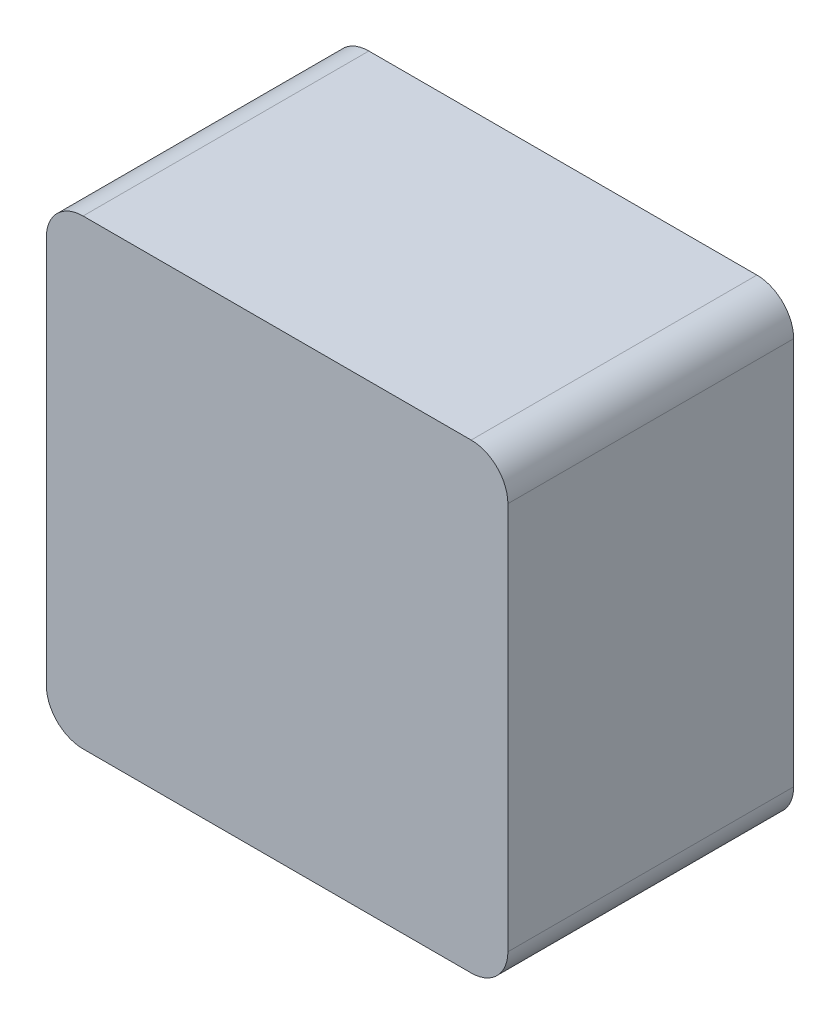
ISO-10303-21;
HEADER;
FILE_DESCRIPTION(('STEP AP214'),'2;1');
FILE_NAME('part.step','',(''),(''),'','','');
FILE_SCHEMA(('AUTOMOTIVE_DESIGN { 1 0 10303 214 1 1 1 1 }'));
ENDSEC;
DATA;
#1=APPLICATION_CONTEXT('core data for automotive mechanical design processes');
#2=APPLICATION_PROTOCOL_DEFINITION('international standard','automotive_design',2000,#1);
#3=PRODUCT_CONTEXT('',#1,'mechanical');
#4=PRODUCT('Part','Part','',(#3));
#5=PRODUCT_RELATED_PRODUCT_CATEGORY('part','',(#4));
#6=PRODUCT_DEFINITION_FORMATION('','',#4);
#7=PRODUCT_DEFINITION_CONTEXT('part definition',#1,'design');
#8=PRODUCT_DEFINITION('design','',#6,#7);
#9=PRODUCT_DEFINITION_SHAPE('','',#8);
#10=(LENGTH_UNIT() NAMED_UNIT(*) SI_UNIT(.MILLI.,.METRE.));
#11=(NAMED_UNIT(*) PLANE_ANGLE_UNIT() SI_UNIT($,.RADIAN.));
#12=(NAMED_UNIT(*) SI_UNIT($,.STERADIAN.) SOLID_ANGLE_UNIT());
#13=UNCERTAINTY_MEASURE_WITH_UNIT(LENGTH_MEASURE(1.E-05),#10,'distance_accuracy_value','');
#14=(GEOMETRIC_REPRESENTATION_CONTEXT(3) GLOBAL_UNCERTAINTY_ASSIGNED_CONTEXT((#13)) GLOBAL_UNIT_ASSIGNED_CONTEXT((#10,
#11,#12)) REPRESENTATION_CONTEXT('',''));
#15=CARTESIAN_POINT('',(0.,0.,0.));
#16=DIRECTION('',(0.,0.,1.));
#17=DIRECTION('',(1.,0.,0.));
#18=AXIS2_PLACEMENT_3D('',#15,#16,#17);
#19=CARTESIAN_POINT('',(-47.53,47.53,0.));
#20=DIRECTION('',(0.,0.,1.));
#21=DIRECTION('',(1.,0.,0.));
#22=AXIS2_PLACEMENT_3D('',#19,#20,#21);
#23=PLANE('',#22);
#24=CARTESIAN_POINT('',(-47.53,47.53,0.));
#25=DIRECTION('',(0.,0.,1.));
#26=DIRECTION('',(1.,0.,0.));
#27=AXIS2_PLACEMENT_3D('',#24,#25,#26);
#28=CIRCLE('',#27,9.);
#29=CARTESIAN_POINT('',(-47.53,56.53,0.));
#30=VERTEX_POINT('',#29);
#31=CARTESIAN_POINT('',(-56.53,47.53,0.));
#32=VERTEX_POINT('',#31);
#33=EDGE_CURVE('E303',#30,#32,#28,.T.);
#34=ORIENTED_EDGE('',*,*,#33,.F.);
#35=DIRECTION('',(-1.,0.,0.));
#36=VECTOR('',#35,1.);
#37=CARTESIAN_POINT('',(-47.53,56.53,0.));
#38=LINE('',#37,#36);
#39=CARTESIAN_POINT('',(47.5299999999999,56.53,0.));
#40=VERTEX_POINT('',#39);
#41=EDGE_CURVE('E318',#40,#30,#38,.T.);
#42=ORIENTED_EDGE('',*,*,#41,.F.);
#43=CARTESIAN_POINT('',(47.53,47.53,0.));
#44=DIRECTION('',(0.,0.,1.));
#45=DIRECTION('',(-1.,0.,0.));
#46=AXIS2_PLACEMENT_3D('',#43,#44,#45);
#47=CIRCLE('',#46,9.);
#48=CARTESIAN_POINT('',(56.53,47.5299999999999,0.));
#49=VERTEX_POINT('',#48);
#50=EDGE_CURVE('E316',#49,#40,#47,.T.);
#51=ORIENTED_EDGE('',*,*,#50,.F.);
#52=DIRECTION('',(0.,1.,0.));
#53=VECTOR('',#52,1.);
#54=CARTESIAN_POINT('',(56.53,47.5299999999999,0.));
#55=LINE('',#54,#53);
#56=CARTESIAN_POINT('',(56.53,-47.53,0.));
#57=VERTEX_POINT('',#56);
#58=EDGE_CURVE('E314',#57,#49,#55,.T.);
#59=ORIENTED_EDGE('',*,*,#58,.F.);
#60=CARTESIAN_POINT('',(47.53,-47.53,0.));
#61=DIRECTION('',(0.,0.,1.));
#62=DIRECTION('',(1.,0.,0.));
#63=AXIS2_PLACEMENT_3D('',#60,#61,#62);
#64=CIRCLE('',#63,9.);
#65=CARTESIAN_POINT('',(47.5299999999999,-56.53,0.));
#66=VERTEX_POINT('',#65);
#67=EDGE_CURVE('E312',#66,#57,#64,.T.);
#68=ORIENTED_EDGE('',*,*,#67,.F.);
#69=DIRECTION('',(1.,0.,0.));
#70=VECTOR('',#69,1.);
#71=CARTESIAN_POINT('',(-47.53,-56.53,0.));
#72=LINE('',#71,#70);
#73=CARTESIAN_POINT('',(-47.53,-56.53,0.));
#74=VERTEX_POINT('',#73);
#75=EDGE_CURVE('E310',#74,#66,#72,.T.);
#76=ORIENTED_EDGE('',*,*,#75,.F.);
#77=CARTESIAN_POINT('',(-47.53,-47.53,0.));
#78=DIRECTION('',(0.,0.,1.));
#79=DIRECTION('',(1.,0.,0.));
#80=AXIS2_PLACEMENT_3D('',#77,#78,#79);
#81=CIRCLE('',#80,9.);
#82=CARTESIAN_POINT('',(-56.53,-47.5299999999999,0.));
#83=VERTEX_POINT('',#82);
#84=EDGE_CURVE('E308',#83,#74,#81,.T.);
#85=ORIENTED_EDGE('',*,*,#84,.F.);
#86=DIRECTION('',(0.,-1.,0.));
#87=VECTOR('',#86,1.);
#88=CARTESIAN_POINT('',(-56.53,47.53,0.));
#89=LINE('',#88,#87);
#90=EDGE_CURVE('E306',#32,#83,#89,.T.);
#91=ORIENTED_EDGE('',*,*,#90,.F.);
#92=EDGE_LOOP('',(#34,#42,#51,#59,#68,#76,#85,#91));
#93=FACE_BOUND('',#92,.T.);
#94=CARTESIAN_POINT('',(47.53,47.53,0.));
#95=DIRECTION('',(0.,0.,1.));
#96=DIRECTION('',(-1.,0.,0.));
#97=AXIS2_PLACEMENT_3D('',#94,#95,#96);
#98=CIRCLE('',#97,5.);
#99=CARTESIAN_POINT('',(52.53,47.53,0.));
#100=VERTEX_POINT('',#99);
#101=CARTESIAN_POINT('',(47.5299999999999,52.53,0.));
#102=VERTEX_POINT('',#101);
#103=EDGE_CURVE('E237',#100,#102,#98,.T.);
#104=ORIENTED_EDGE('',*,*,#103,.T.);
#105=DIRECTION('',(-1.,0.,0.));
#106=VECTOR('',#105,1.);
#107=CARTESIAN_POINT('',(-47.53,52.53,0.));
#108=LINE('',#107,#106);
#109=CARTESIAN_POINT('',(-47.53,52.53,0.));
#110=VERTEX_POINT('',#109);
#111=EDGE_CURVE('E266',#102,#110,#108,.T.);
#112=ORIENTED_EDGE('',*,*,#111,.T.);
#113=CARTESIAN_POINT('',(-47.53,47.53,0.));
#114=DIRECTION('',(0.,0.,1.));
#115=DIRECTION('',(1.,0.,0.));
#116=AXIS2_PLACEMENT_3D('',#113,#114,#115);
#117=CIRCLE('',#116,5.);
#118=CARTESIAN_POINT('',(-52.53,47.53,0.));
#119=VERTEX_POINT('',#118);
#120=EDGE_CURVE('E269',#110,#119,#117,.T.);
#121=ORIENTED_EDGE('',*,*,#120,.T.);
#122=DIRECTION('',(0.,-1.,0.));
#123=VECTOR('',#122,1.);
#124=CARTESIAN_POINT('',(-52.53,47.53,0.));
#125=LINE('',#124,#123);
#126=CARTESIAN_POINT('',(-52.53,-47.53,0.));
#127=VERTEX_POINT('',#126);
#128=EDGE_CURVE('E272',#119,#127,#125,.T.);
#129=ORIENTED_EDGE('',*,*,#128,.T.);
#130=CARTESIAN_POINT('',(-47.53,-47.53,0.));
#131=DIRECTION('',(0.,0.,1.));
#132=DIRECTION('',(1.,0.,0.));
#133=AXIS2_PLACEMENT_3D('',#130,#131,#132);
#134=CIRCLE('',#133,5.);
#135=CARTESIAN_POINT('',(-47.53,-52.53,0.));
#136=VERTEX_POINT('',#135);
#137=EDGE_CURVE('E275',#127,#136,#134,.T.);
#138=ORIENTED_EDGE('',*,*,#137,.T.);
#139=DIRECTION('',(1.,0.,0.));
#140=VECTOR('',#139,1.);
#141=CARTESIAN_POINT('',(-47.53,-52.53,0.));
#142=LINE('',#141,#140);
#143=CARTESIAN_POINT('',(47.5299999999999,-52.53,0.));
#144=VERTEX_POINT('',#143);
#145=EDGE_CURVE('E278',#136,#144,#142,.T.);
#146=ORIENTED_EDGE('',*,*,#145,.T.);
#147=CARTESIAN_POINT('',(47.53,-47.53,0.));
#148=DIRECTION('',(0.,0.,1.));
#149=DIRECTION('',(1.,0.,0.));
#150=AXIS2_PLACEMENT_3D('',#147,#148,#149);
#151=CIRCLE('',#150,5.);
#152=CARTESIAN_POINT('',(52.53,-47.53,0.));
#153=VERTEX_POINT('',#152);
#154=EDGE_CURVE('E281',#144,#153,#151,.T.);
#155=ORIENTED_EDGE('',*,*,#154,.T.);
#156=DIRECTION('',(0.,1.,0.));
#157=VECTOR('',#156,1.);
#158=CARTESIAN_POINT('',(52.53,47.53,0.));
#159=LINE('',#158,#157);
#160=EDGE_CURVE('E242',#153,#100,#159,.T.);
#161=ORIENTED_EDGE('',*,*,#160,.T.);
#162=EDGE_LOOP('',(#104,#112,#121,#129,#138,#146,#155,#161));
#163=FACE_BOUND('',#162,.T.);
#164=ADVANCED_FACE('F40',(#93,#163),#23,.F.);
#165=CARTESIAN_POINT('',(-47.53,47.53,68.58));
#166=DIRECTION('',(0.,0.,-1.));
#167=DIRECTION('',(-1.,0.,0.));
#168=AXIS2_PLACEMENT_3D('',#165,#166,#167);
#169=CYLINDRICAL_SURFACE('',#168,9.);
#170=ORIENTED_EDGE('',*,*,#33,.T.);
#171=DIRECTION('',(0.,0.,-1.));
#172=VECTOR('',#171,1.);
#173=CARTESIAN_POINT('',(-56.53,47.53,68.58));
#174=LINE('',#173,#172);
#175=CARTESIAN_POINT('',(-56.53,47.53,70.));
#176=VERTEX_POINT('',#175);
#177=EDGE_CURVE('E11',#176,#32,#174,.T.);
#178=ORIENTED_EDGE('',*,*,#177,.F.);
#179=CARTESIAN_POINT('',(-47.53,47.53,70.));
#180=DIRECTION('',(0.,0.,1.));
#181=DIRECTION('',(1.,0.,0.));
#182=AXIS2_PLACEMENT_3D('',#179,#180,#181);
#183=CIRCLE('',#182,9.);
#184=CARTESIAN_POINT('',(-47.53,56.53,70.));
#185=VERTEX_POINT('',#184);
#186=EDGE_CURVE('E194',#185,#176,#183,.T.);
#187=ORIENTED_EDGE('',*,*,#186,.F.);
#188=DIRECTION('',(0.,0.,-1.));
#189=VECTOR('',#188,1.);
#190=CARTESIAN_POINT('',(-47.53,56.53,68.58));
#191=LINE('',#190,#189);
#192=EDGE_CURVE('E320',#185,#30,#191,.T.);
#193=ORIENTED_EDGE('',*,*,#192,.T.);
#194=EDGE_LOOP('',(#170,#178,#187,#193));
#195=FACE_BOUND('',#194,.T.);
#196=ADVANCED_FACE('F42',(#195),#169,.T.);
#197=CARTESIAN_POINT('',(-56.53,47.53,68.58));
#198=DIRECTION('',(1.,0.,0.));
#199=DIRECTION('',(0.,0.,-1.));
#200=AXIS2_PLACEMENT_3D('',#197,#198,#199);
#201=PLANE('',#200);
#202=DIRECTION('',(0.,0.,-1.));
#203=VECTOR('',#202,1.);
#204=CARTESIAN_POINT('',(-56.53,46.03,63.));
#205=LINE('',#204,#203);
#206=CARTESIAN_POINT('',(-56.53,46.03,68.));
#207=VERTEX_POINT('',#206);
#208=CARTESIAN_POINT('',(-56.53,46.03,63.));
#209=VERTEX_POINT('',#208);
#210=EDGE_CURVE('E200',#207,#209,#205,.T.);
#211=ORIENTED_EDGE('',*,*,#210,.F.);
#212=DIRECTION('',(0.,1.,0.));
#213=VECTOR('',#212,1.);
#214=CARTESIAN_POINT('',(-56.53,46.03,68.));
#215=LINE('',#214,#213);
#216=CARTESIAN_POINT('',(-56.53,-46.03,68.));
#217=VERTEX_POINT('',#216);
#218=EDGE_CURVE('E55',#217,#207,#215,.T.);
#219=ORIENTED_EDGE('',*,*,#218,.F.);
#220=DIRECTION('',(0.,0.,1.));
#221=VECTOR('',#220,1.);
#222=CARTESIAN_POINT('',(-56.53,-46.03,63.));
#223=LINE('',#222,#221);
#224=CARTESIAN_POINT('',(-56.53,-46.03,63.));
#225=VERTEX_POINT('',#224);
#226=EDGE_CURVE('E187',#225,#217,#223,.T.);
#227=ORIENTED_EDGE('',*,*,#226,.F.);
#228=DIRECTION('',(0.,-1.,0.));
#229=VECTOR('',#228,1.);
#230=CARTESIAN_POINT('',(-56.53,46.03,63.));
#231=LINE('',#230,#229);
#232=EDGE_CURVE('E195',#209,#225,#231,.T.);
#233=ORIENTED_EDGE('',*,*,#232,.F.);
#234=EDGE_LOOP('',(#211,#219,#227,#233));
#235=FACE_BOUND('',#234,.T.);
#236=ORIENTED_EDGE('',*,*,#90,.T.);
#237=DIRECTION('',(0.,0.,-1.));
#238=VECTOR('',#237,1.);
#239=CARTESIAN_POINT('',(-56.53,-47.5299999999999,68.58));
#240=LINE('',#239,#238);
#241=CARTESIAN_POINT('',(-56.53,-47.5299999999999,70.));
#242=VERTEX_POINT('',#241);
#243=EDGE_CURVE('E48',#242,#83,#240,.T.);
#244=ORIENTED_EDGE('',*,*,#243,.F.);
#245=DIRECTION('',(0.,-1.,0.));
#246=VECTOR('',#245,1.);
#247=CARTESIAN_POINT('',(-56.53,47.53,70.));
#248=LINE('',#247,#246);
#249=EDGE_CURVE('E216',#176,#242,#248,.T.);
#250=ORIENTED_EDGE('',*,*,#249,.F.);
#251=ORIENTED_EDGE('',*,*,#177,.T.);
#252=EDGE_LOOP('',(#236,#244,#250,#251));
#253=FACE_BOUND('',#252,.T.);
#254=ADVANCED_FACE('F198',(#235,#253),#201,.F.);
#255=CARTESIAN_POINT('',(-47.53,-47.53,68.58));
#256=DIRECTION('',(0.,0.,-1.));
#257=DIRECTION('',(-1.,0.,0.));
#258=AXIS2_PLACEMENT_3D('',#255,#256,#257);
#259=CYLINDRICAL_SURFACE('',#258,9.);
#260=ORIENTED_EDGE('',*,*,#84,.T.);
#261=DIRECTION('',(0.,0.,-1.));
#262=VECTOR('',#261,1.);
#263=CARTESIAN_POINT('',(-47.53,-56.53,68.58));
#264=LINE('',#263,#262);
#265=CARTESIAN_POINT('',(-47.53,-56.53,70.));
#266=VERTEX_POINT('',#265);
#267=EDGE_CURVE('E335',#266,#74,#264,.T.);
#268=ORIENTED_EDGE('',*,*,#267,.F.);
#269=CARTESIAN_POINT('',(-47.53,-47.53,70.));
#270=DIRECTION('',(0.,0.,1.));
#271=DIRECTION('',(1.,0.,0.));
#272=AXIS2_PLACEMENT_3D('',#269,#270,#271);
#273=CIRCLE('',#272,9.);
#274=EDGE_CURVE('E219',#242,#266,#273,.T.);
#275=ORIENTED_EDGE('',*,*,#274,.F.);
#276=ORIENTED_EDGE('',*,*,#243,.T.);
#277=EDGE_LOOP('',(#260,#268,#275,#276));
#278=FACE_BOUND('',#277,.T.);
#279=ADVANCED_FACE('F341',(#278),#259,.T.);
#280=CARTESIAN_POINT('',(-47.53,-56.53,68.58));
#281=DIRECTION('',(0.,1.,0.));
#282=DIRECTION('',(0.,0.,1.));
#283=AXIS2_PLACEMENT_3D('',#280,#281,#282);
#284=PLANE('',#283);
#285=ORIENTED_EDGE('',*,*,#75,.T.);
#286=DIRECTION('',(0.,0.,-1.));
#287=VECTOR('',#286,1.);
#288=CARTESIAN_POINT('',(47.5299999999999,-56.53,68.58));
#289=LINE('',#288,#287);
#290=CARTESIAN_POINT('',(47.5299999999999,-56.53,70.));
#291=VERTEX_POINT('',#290);
#292=EDGE_CURVE('E332',#291,#66,#289,.T.);
#293=ORIENTED_EDGE('',*,*,#292,.F.);
#294=DIRECTION('',(1.,0.,0.));
#295=VECTOR('',#294,1.);
#296=CARTESIAN_POINT('',(-47.53,-56.53,70.));
#297=LINE('',#296,#295);
#298=EDGE_CURVE('E222',#266,#291,#297,.T.);
#299=ORIENTED_EDGE('',*,*,#298,.F.);
#300=ORIENTED_EDGE('',*,*,#267,.T.);
#301=EDGE_LOOP('',(#285,#293,#299,#300));
#302=FACE_BOUND('',#301,.T.);
#303=ADVANCED_FACE('F350',(#302),#284,.F.);
#304=CARTESIAN_POINT('',(47.53,-47.53,68.58));
#305=DIRECTION('',(0.,0.,-1.));
#306=DIRECTION('',(-1.,0.,0.));
#307=AXIS2_PLACEMENT_3D('',#304,#305,#306);
#308=CYLINDRICAL_SURFACE('',#307,9.);
#309=ORIENTED_EDGE('',*,*,#67,.T.);
#310=DIRECTION('',(0.,0.,-1.));
#311=VECTOR('',#310,1.);
#312=CARTESIAN_POINT('',(56.53,-47.53,68.58));
#313=LINE('',#312,#311);
#314=CARTESIAN_POINT('',(56.53,-47.53,70.));
#315=VERTEX_POINT('',#314);
#316=EDGE_CURVE('E329',#315,#57,#313,.T.);
#317=ORIENTED_EDGE('',*,*,#316,.F.);
#318=CARTESIAN_POINT('',(47.53,-47.53,70.));
#319=DIRECTION('',(0.,0.,1.));
#320=DIRECTION('',(1.,0.,0.));
#321=AXIS2_PLACEMENT_3D('',#318,#319,#320);
#322=CIRCLE('',#321,9.);
#323=EDGE_CURVE('E225',#291,#315,#322,.T.);
#324=ORIENTED_EDGE('',*,*,#323,.F.);
#325=ORIENTED_EDGE('',*,*,#292,.T.);
#326=EDGE_LOOP('',(#309,#317,#324,#325));
#327=FACE_BOUND('',#326,.T.);
#328=ADVANCED_FACE('F354',(#327),#308,.T.);
#329=CARTESIAN_POINT('',(56.53,47.5299999999999,68.58));
#330=DIRECTION('',(-1.,0.,0.));
#331=DIRECTION('',(0.,0.,1.));
#332=AXIS2_PLACEMENT_3D('',#329,#330,#331);
#333=PLANE('',#332);
#334=ORIENTED_EDGE('',*,*,#58,.T.);
#335=DIRECTION('',(0.,0.,-1.));
#336=VECTOR('',#335,1.);
#337=CARTESIAN_POINT('',(56.53,47.5299999999999,68.58));
#338=LINE('',#337,#336);
#339=CARTESIAN_POINT('',(56.53,47.5299999999999,70.));
#340=VERTEX_POINT('',#339);
#341=EDGE_CURVE('E326',#340,#49,#338,.T.);
#342=ORIENTED_EDGE('',*,*,#341,.F.);
#343=DIRECTION('',(0.,1.,0.));
#344=VECTOR('',#343,1.);
#345=CARTESIAN_POINT('',(56.53,-47.53,70.));
#346=LINE('',#345,#344);
#347=EDGE_CURVE('E228',#315,#340,#346,.T.);
#348=ORIENTED_EDGE('',*,*,#347,.F.);
#349=ORIENTED_EDGE('',*,*,#316,.T.);
#350=EDGE_LOOP('',(#334,#342,#348,#349));
#351=FACE_BOUND('',#350,.T.);
#352=ADVANCED_FACE('F360',(#351),#333,.F.);
#353=CARTESIAN_POINT('',(47.53,47.53,68.58));
#354=DIRECTION('',(0.,0.,-1.));
#355=DIRECTION('',(-1.,0.,0.));
#356=AXIS2_PLACEMENT_3D('',#353,#354,#355);
#357=CYLINDRICAL_SURFACE('',#356,9.);
#358=ORIENTED_EDGE('',*,*,#50,.T.);
#359=DIRECTION('',(0.,0.,-1.));
#360=VECTOR('',#359,1.);
#361=CARTESIAN_POINT('',(47.5299999999999,56.53,68.58));
#362=LINE('',#361,#360);
#363=CARTESIAN_POINT('',(47.5299999999999,56.53,70.));
#364=VERTEX_POINT('',#363);
#365=EDGE_CURVE('E323',#364,#40,#362,.T.);
#366=ORIENTED_EDGE('',*,*,#365,.F.);
#367=CARTESIAN_POINT('',(47.53,47.53,70.));
#368=DIRECTION('',(0.,0.,1.));
#369=DIRECTION('',(1.,0.,0.));
#370=AXIS2_PLACEMENT_3D('',#367,#368,#369);
#371=CIRCLE('',#370,9.);
#372=EDGE_CURVE('E231',#340,#364,#371,.T.);
#373=ORIENTED_EDGE('',*,*,#372,.F.);
#374=ORIENTED_EDGE('',*,*,#341,.T.);
#375=EDGE_LOOP('',(#358,#366,#373,#374));
#376=FACE_BOUND('',#375,.T.);
#377=ADVANCED_FACE('F363',(#376),#357,.T.);
#378=CARTESIAN_POINT('',(-47.53,56.53,68.58));
#379=DIRECTION('',(0.,-1.,0.));
#380=DIRECTION('',(0.,0.,-1.));
#381=AXIS2_PLACEMENT_3D('',#378,#379,#380);
#382=PLANE('',#381);
#383=ORIENTED_EDGE('',*,*,#41,.T.);
#384=ORIENTED_EDGE('',*,*,#192,.F.);
#385=DIRECTION('',(-1.,0.,0.));
#386=VECTOR('',#385,1.);
#387=CARTESIAN_POINT('',(47.5299999999999,56.53,70.));
#388=LINE('',#387,#386);
#389=EDGE_CURVE('E234',#364,#185,#388,.T.);
#390=ORIENTED_EDGE('',*,*,#389,.F.);
#391=ORIENTED_EDGE('',*,*,#365,.T.);
#392=EDGE_LOOP('',(#383,#384,#390,#391));
#393=FACE_BOUND('',#392,.T.);
#394=ADVANCED_FACE('F366',(#393),#382,.F.);
#395=CARTESIAN_POINT('',(47.53,47.53,68.58));
#396=DIRECTION('',(0.,0.,-1.));
#397=DIRECTION('',(-1.,0.,0.));
#398=AXIS2_PLACEMENT_3D('',#395,#396,#397);
#399=CYLINDRICAL_SURFACE('',#398,5.);
#400=ORIENTED_EDGE('',*,*,#103,.F.);
#401=DIRECTION('',(0.,0.,-1.));
#402=VECTOR('',#401,1.);
#403=CARTESIAN_POINT('',(52.53,47.53,68.58));
#404=LINE('',#403,#402);
#405=CARTESIAN_POINT('',(52.53,47.53,68.58));
#406=VERTEX_POINT('',#405);
#407=EDGE_CURVE('E263',#406,#100,#404,.T.);
#408=ORIENTED_EDGE('',*,*,#407,.F.);
#409=CARTESIAN_POINT('',(47.53,47.53,68.58));
#410=DIRECTION('',(0.,0.,1.));
#411=DIRECTION('',(-1.,0.,0.));
#412=AXIS2_PLACEMENT_3D('',#409,#410,#411);
#413=CIRCLE('',#412,5.);
#414=CARTESIAN_POINT('',(47.5299999999999,52.53,68.58));
#415=VERTEX_POINT('',#414);
#416=EDGE_CURVE('E238',#406,#415,#413,.T.);
#417=ORIENTED_EDGE('',*,*,#416,.T.);
#418=DIRECTION('',(0.,0.,-1.));
#419=VECTOR('',#418,1.);
#420=CARTESIAN_POINT('',(47.5299999999999,52.53,68.58));
#421=LINE('',#420,#419);
#422=EDGE_CURVE('E300',#415,#102,#421,.T.);
#423=ORIENTED_EDGE('',*,*,#422,.T.);
#424=EDGE_LOOP('',(#400,#408,#417,#423));
#425=FACE_BOUND('',#424,.T.);
#426=ADVANCED_FACE('F384',(#425),#399,.F.);
#427=CARTESIAN_POINT('',(-47.53,52.53,68.58));
#428=DIRECTION('',(0.,-1.,0.));
#429=DIRECTION('',(0.,0.,-1.));
#430=AXIS2_PLACEMENT_3D('',#427,#428,#429);
#431=PLANE('',#430);
#432=ORIENTED_EDGE('',*,*,#111,.F.);
#433=ORIENTED_EDGE('',*,*,#422,.F.);
#434=DIRECTION('',(-1.,0.,0.));
#435=VECTOR('',#434,1.);
#436=CARTESIAN_POINT('',(-47.53,52.53,68.58));
#437=LINE('',#436,#435);
#438=CARTESIAN_POINT('',(-47.53,52.53,68.58));
#439=VERTEX_POINT('',#438);
#440=EDGE_CURVE('E241',#415,#439,#437,.T.);
#441=ORIENTED_EDGE('',*,*,#440,.T.);
#442=DIRECTION('',(0.,0.,-1.));
#443=VECTOR('',#442,1.);
#444=CARTESIAN_POINT('',(-47.53,52.53,68.58));
#445=LINE('',#444,#443);
#446=EDGE_CURVE('E298',#439,#110,#445,.T.);
#447=ORIENTED_EDGE('',*,*,#446,.T.);
#448=EDGE_LOOP('',(#432,#433,#441,#447));
#449=FACE_BOUND('',#448,.T.);
#450=ADVANCED_FACE('F421',(#449),#431,.T.);
#451=CARTESIAN_POINT('',(-47.53,47.53,68.58));
#452=DIRECTION('',(0.,0.,-1.));
#453=DIRECTION('',(-1.,0.,0.));
#454=AXIS2_PLACEMENT_3D('',#451,#452,#453);
#455=CYLINDRICAL_SURFACE('',#454,5.);
#456=ORIENTED_EDGE('',*,*,#120,.F.);
#457=ORIENTED_EDGE('',*,*,#446,.F.);
#458=CARTESIAN_POINT('',(-47.53,47.53,68.58));
#459=DIRECTION('',(0.,0.,1.));
#460=DIRECTION('',(1.,0.,0.));
#461=AXIS2_PLACEMENT_3D('',#458,#459,#460);
#462=CIRCLE('',#461,5.);
#463=CARTESIAN_POINT('',(-52.53,47.53,68.58));
#464=VERTEX_POINT('',#463);
#465=EDGE_CURVE('E245',#439,#464,#462,.T.);
#466=ORIENTED_EDGE('',*,*,#465,.T.);
#467=DIRECTION('',(0.,0.,-1.));
#468=VECTOR('',#467,1.);
#469=CARTESIAN_POINT('',(-52.53,47.53,68.58));
#470=LINE('',#469,#468);
#471=EDGE_CURVE('E296',#464,#119,#470,.T.);
#472=ORIENTED_EDGE('',*,*,#471,.T.);
#473=EDGE_LOOP('',(#456,#457,#466,#472));
#474=FACE_BOUND('',#473,.T.);
#475=ADVANCED_FACE('F428',(#474),#455,.F.);
#476=CARTESIAN_POINT('',(-52.53,47.53,68.58));
#477=DIRECTION('',(1.,0.,0.));
#478=DIRECTION('',(0.,0.,-1.));
#479=AXIS2_PLACEMENT_3D('',#476,#477,#478);
#480=PLANE('',#479);
#481=DIRECTION('',(0.,1.,0.));
#482=VECTOR('',#481,1.);
#483=CARTESIAN_POINT('',(-52.53,46.03,68.));
#484=LINE('',#483,#482);
#485=CARTESIAN_POINT('',(-52.53,-46.03,68.));
#486=VERTEX_POINT('',#485);
#487=CARTESIAN_POINT('',(-52.53,46.03,68.));
#488=VERTEX_POINT('',#487);
#489=EDGE_CURVE('E180',#486,#488,#484,.T.);
#490=ORIENTED_EDGE('',*,*,#489,.T.);
#491=DIRECTION('',(0.,0.,-1.));
#492=VECTOR('',#491,1.);
#493=CARTESIAN_POINT('',(-52.53,46.03,63.));
#494=LINE('',#493,#492);
#495=CARTESIAN_POINT('',(-52.53,46.03,63.));
#496=VERTEX_POINT('',#495);
#497=EDGE_CURVE('E203',#488,#496,#494,.T.);
#498=ORIENTED_EDGE('',*,*,#497,.T.);
#499=DIRECTION('',(0.,-1.,0.));
#500=VECTOR('',#499,1.);
#501=CARTESIAN_POINT('',(-52.53,46.03,63.));
#502=LINE('',#501,#500);
#503=CARTESIAN_POINT('',(-52.53,-46.03,63.));
#504=VERTEX_POINT('',#503);
#505=EDGE_CURVE('E183',#496,#504,#502,.T.);
#506=ORIENTED_EDGE('',*,*,#505,.T.);
#507=DIRECTION('',(0.,0.,1.));
#508=VECTOR('',#507,1.);
#509=CARTESIAN_POINT('',(-52.53,-46.03,63.));
#510=LINE('',#509,#508);
#511=EDGE_CURVE('E184',#504,#486,#510,.T.);
#512=ORIENTED_EDGE('',*,*,#511,.T.);
#513=EDGE_LOOP('',(#490,#498,#506,#512));
#514=FACE_BOUND('',#513,.T.);
#515=ORIENTED_EDGE('',*,*,#128,.F.);
#516=ORIENTED_EDGE('',*,*,#471,.F.);
#517=DIRECTION('',(0.,-1.,0.));
#518=VECTOR('',#517,1.);
#519=CARTESIAN_POINT('',(-52.53,47.53,68.58));
#520=LINE('',#519,#518);
#521=CARTESIAN_POINT('',(-52.53,-47.53,68.58));
#522=VERTEX_POINT('',#521);
#523=EDGE_CURVE('E248',#464,#522,#520,.T.);
#524=ORIENTED_EDGE('',*,*,#523,.T.);
#525=DIRECTION('',(0.,0.,-1.));
#526=VECTOR('',#525,1.);
#527=CARTESIAN_POINT('',(-52.53,-47.53,68.58));
#528=LINE('',#527,#526);
#529=EDGE_CURVE('E294',#522,#127,#528,.T.);
#530=ORIENTED_EDGE('',*,*,#529,.T.);
#531=EDGE_LOOP('',(#515,#516,#524,#530));
#532=FACE_BOUND('',#531,.T.);
#533=ADVANCED_FACE('F435',(#514,#532),#480,.T.);
#534=CARTESIAN_POINT('',(-47.53,-47.53,68.58));
#535=DIRECTION('',(0.,0.,-1.));
#536=DIRECTION('',(-1.,0.,0.));
#537=AXIS2_PLACEMENT_3D('',#534,#535,#536);
#538=CYLINDRICAL_SURFACE('',#537,5.);
#539=ORIENTED_EDGE('',*,*,#137,.F.);
#540=ORIENTED_EDGE('',*,*,#529,.F.);
#541=CARTESIAN_POINT('',(-47.53,-47.53,68.58));
#542=DIRECTION('',(0.,0.,1.));
#543=DIRECTION('',(1.,0.,0.));
#544=AXIS2_PLACEMENT_3D('',#541,#542,#543);
#545=CIRCLE('',#544,5.);
#546=CARTESIAN_POINT('',(-47.53,-52.53,68.58));
#547=VERTEX_POINT('',#546);
#548=EDGE_CURVE('E251',#522,#547,#545,.T.);
#549=ORIENTED_EDGE('',*,*,#548,.T.);
#550=DIRECTION('',(0.,0.,-1.));
#551=VECTOR('',#550,1.);
#552=CARTESIAN_POINT('',(-47.53,-52.53,68.58));
#553=LINE('',#552,#551);
#554=EDGE_CURVE('E292',#547,#136,#553,.T.);
#555=ORIENTED_EDGE('',*,*,#554,.T.);
#556=EDGE_LOOP('',(#539,#540,#549,#555));
#557=FACE_BOUND('',#556,.T.);
#558=ADVANCED_FACE('F444',(#557),#538,.F.);
#559=CARTESIAN_POINT('',(-47.53,-52.53,68.58));
#560=DIRECTION('',(0.,1.,0.));
#561=DIRECTION('',(0.,0.,1.));
#562=AXIS2_PLACEMENT_3D('',#559,#560,#561);
#563=PLANE('',#562);
#564=ORIENTED_EDGE('',*,*,#145,.F.);
#565=ORIENTED_EDGE('',*,*,#554,.F.);
#566=DIRECTION('',(1.,0.,0.));
#567=VECTOR('',#566,1.);
#568=CARTESIAN_POINT('',(-47.53,-52.53,68.58));
#569=LINE('',#568,#567);
#570=CARTESIAN_POINT('',(47.5299999999999,-52.53,68.58));
#571=VERTEX_POINT('',#570);
#572=EDGE_CURVE('E254',#547,#571,#569,.T.);
#573=ORIENTED_EDGE('',*,*,#572,.T.);
#574=DIRECTION('',(0.,0.,-1.));
#575=VECTOR('',#574,1.);
#576=CARTESIAN_POINT('',(47.5299999999999,-52.53,68.58));
#577=LINE('',#576,#575);
#578=EDGE_CURVE('E290',#571,#144,#577,.T.);
#579=ORIENTED_EDGE('',*,*,#578,.T.);
#580=EDGE_LOOP('',(#564,#565,#573,#579));
#581=FACE_BOUND('',#580,.T.);
#582=ADVANCED_FACE('F454',(#581),#563,.T.);
#583=CARTESIAN_POINT('',(47.53,-47.53,68.58));
#584=DIRECTION('',(0.,0.,-1.));
#585=DIRECTION('',(-1.,0.,0.));
#586=AXIS2_PLACEMENT_3D('',#583,#584,#585);
#587=CYLINDRICAL_SURFACE('',#586,5.);
#588=ORIENTED_EDGE('',*,*,#154,.F.);
#589=ORIENTED_EDGE('',*,*,#578,.F.);
#590=CARTESIAN_POINT('',(47.53,-47.53,68.58));
#591=DIRECTION('',(0.,0.,1.));
#592=DIRECTION('',(1.,0.,0.));
#593=AXIS2_PLACEMENT_3D('',#590,#591,#592);
#594=CIRCLE('',#593,5.);
#595=CARTESIAN_POINT('',(52.53,-47.53,68.58));
#596=VERTEX_POINT('',#595);
#597=EDGE_CURVE('E257',#571,#596,#594,.T.);
#598=ORIENTED_EDGE('',*,*,#597,.T.);
#599=DIRECTION('',(0.,0.,-1.));
#600=VECTOR('',#599,1.);
#601=CARTESIAN_POINT('',(52.53,-47.53,68.58));
#602=LINE('',#601,#600);
#603=EDGE_CURVE('E288',#596,#153,#602,.T.);
#604=ORIENTED_EDGE('',*,*,#603,.T.);
#605=EDGE_LOOP('',(#588,#589,#598,#604));
#606=FACE_BOUND('',#605,.T.);
#607=ADVANCED_FACE('F461',(#606),#587,.F.);
#608=CARTESIAN_POINT('',(52.53,47.53,68.58));
#609=DIRECTION('',(-1.,0.,0.));
#610=DIRECTION('',(0.,0.,1.));
#611=AXIS2_PLACEMENT_3D('',#608,#609,#610);
#612=PLANE('',#611);
#613=ORIENTED_EDGE('',*,*,#160,.F.);
#614=ORIENTED_EDGE('',*,*,#603,.F.);
#615=DIRECTION('',(0.,1.,0.));
#616=VECTOR('',#615,1.);
#617=CARTESIAN_POINT('',(52.53,47.53,68.58));
#618=LINE('',#617,#616);
#619=EDGE_CURVE('E260',#596,#406,#618,.T.);
#620=ORIENTED_EDGE('',*,*,#619,.T.);
#621=ORIENTED_EDGE('',*,*,#407,.T.);
#622=EDGE_LOOP('',(#613,#614,#620,#621));
#623=FACE_BOUND('',#622,.T.);
#624=ADVANCED_FACE('F469',(#623),#612,.T.);
#625=CARTESIAN_POINT('',(-47.53,47.53,68.58));
#626=DIRECTION('',(0.,0.,1.));
#627=DIRECTION('',(1.,0.,0.));
#628=AXIS2_PLACEMENT_3D('',#625,#626,#627);
#629=PLANE('',#628);
#630=ORIENTED_EDGE('',*,*,#440,.F.);
#631=ORIENTED_EDGE('',*,*,#416,.F.);
#632=ORIENTED_EDGE('',*,*,#619,.F.);
#633=ORIENTED_EDGE('',*,*,#597,.F.);
#634=ORIENTED_EDGE('',*,*,#572,.F.);
#635=ORIENTED_EDGE('',*,*,#548,.F.);
#636=ORIENTED_EDGE('',*,*,#523,.F.);
#637=ORIENTED_EDGE('',*,*,#465,.F.);
#638=EDGE_LOOP('',(#630,#631,#632,#633,#634,#635,#636,#637));
#639=FACE_BOUND('',#638,.T.);
#640=ADVANCED_FACE('F477',(#639),#629,.F.);
#641=CARTESIAN_POINT('',(-47.53,47.53,70.));
#642=DIRECTION('',(0.,0.,1.));
#643=DIRECTION('',(1.,0.,0.));
#644=AXIS2_PLACEMENT_3D('',#641,#642,#643);
#645=PLANE('',#644);
#646=ORIENTED_EDGE('',*,*,#186,.T.);
#647=ORIENTED_EDGE('',*,*,#249,.T.);
#648=ORIENTED_EDGE('',*,*,#274,.T.);
#649=ORIENTED_EDGE('',*,*,#298,.T.);
#650=ORIENTED_EDGE('',*,*,#323,.T.);
#651=ORIENTED_EDGE('',*,*,#347,.T.);
#652=ORIENTED_EDGE('',*,*,#372,.T.);
#653=ORIENTED_EDGE('',*,*,#389,.T.);
#654=EDGE_LOOP('',(#646,#647,#648,#649,#650,#651,#652,#653));
#655=FACE_BOUND('',#654,.T.);
#656=ADVANCED_FACE('F357',(#655),#645,.T.);
#657=CARTESIAN_POINT('',(56.531,46.03,68.));
#658=DIRECTION('',(0.,0.,1.));
#659=DIRECTION('',(1.,0.,0.));
#660=AXIS2_PLACEMENT_3D('',#657,#658,#659);
#661=PLANE('',#660);
#662=DIRECTION('',(-1.,0.,0.));
#663=VECTOR('',#662,1.);
#664=CARTESIAN_POINT('',(56.531,-46.03,68.));
#665=LINE('',#664,#663);
#666=EDGE_CURVE('E176',#486,#217,#665,.T.);
#667=ORIENTED_EDGE('',*,*,#666,.T.);
#668=ORIENTED_EDGE('',*,*,#218,.T.);
#669=DIRECTION('',(-1.,0.,0.));
#670=VECTOR('',#669,1.);
#671=CARTESIAN_POINT('',(56.531,46.03,68.));
#672=LINE('',#671,#670);
#673=EDGE_CURVE('E208',#488,#207,#672,.T.);
#674=ORIENTED_EDGE('',*,*,#673,.F.);
#675=ORIENTED_EDGE('',*,*,#489,.F.);
#676=EDGE_LOOP('',(#667,#668,#674,#675));
#677=FACE_BOUND('',#676,.T.);
#678=ADVANCED_FACE('F178',(#677),#661,.F.);
#679=CARTESIAN_POINT('',(56.531,-46.03,63.));
#680=DIRECTION('',(0.,-1.,0.));
#681=DIRECTION('',(0.,0.,-1.));
#682=AXIS2_PLACEMENT_3D('',#679,#680,#681);
#683=PLANE('',#682);
#684=DIRECTION('',(-1.,0.,0.));
#685=VECTOR('',#684,1.);
#686=CARTESIAN_POINT('',(56.531,-46.03,63.));
#687=LINE('',#686,#685);
#688=EDGE_CURVE('E190',#504,#225,#687,.T.);
#689=ORIENTED_EDGE('',*,*,#688,.T.);
#690=ORIENTED_EDGE('',*,*,#226,.T.);
#691=ORIENTED_EDGE('',*,*,#666,.F.);
#692=ORIENTED_EDGE('',*,*,#511,.F.);
#693=EDGE_LOOP('',(#689,#690,#691,#692));
#694=FACE_BOUND('',#693,.T.);
#695=ADVANCED_FACE('F188',(#694),#683,.F.);
#696=CARTESIAN_POINT('',(56.531,46.03,63.));
#697=DIRECTION('',(0.,0.,-1.));
#698=DIRECTION('',(-1.,0.,0.));
#699=AXIS2_PLACEMENT_3D('',#696,#697,#698);
#700=PLANE('',#699);
#701=DIRECTION('',(-1.,0.,0.));
#702=VECTOR('',#701,1.);
#703=CARTESIAN_POINT('',(56.531,46.03,63.));
#704=LINE('',#703,#702);
#705=EDGE_CURVE('E63',#496,#209,#704,.T.);
#706=ORIENTED_EDGE('',*,*,#705,.T.);
#707=ORIENTED_EDGE('',*,*,#232,.T.);
#708=ORIENTED_EDGE('',*,*,#688,.F.);
#709=ORIENTED_EDGE('',*,*,#505,.F.);
#710=EDGE_LOOP('',(#706,#707,#708,#709));
#711=FACE_BOUND('',#710,.T.);
#712=ADVANCED_FACE('F502',(#711),#700,.F.);
#713=CARTESIAN_POINT('',(56.531,46.03,63.));
#714=DIRECTION('',(0.,1.,0.));
#715=DIRECTION('',(0.,0.,1.));
#716=AXIS2_PLACEMENT_3D('',#713,#714,#715);
#717=PLANE('',#716);
#718=ORIENTED_EDGE('',*,*,#673,.T.);
#719=ORIENTED_EDGE('',*,*,#210,.T.);
#720=ORIENTED_EDGE('',*,*,#705,.F.);
#721=ORIENTED_EDGE('',*,*,#497,.F.);
#722=EDGE_LOOP('',(#718,#719,#720,#721));
#723=FACE_BOUND('',#722,.T.);
#724=ADVANCED_FACE('F509',(#723),#717,.F.);
#725=CLOSED_SHELL('',(#164,#196,#254,#279,#303,#328,#352,#377,#394,#426,#450,#475,#533,#558,
#582,#607,#624,#640,#656,#678,#695,#712,#724));
#726=MANIFOLD_SOLID_BREP('B2',#725);
#727=ADVANCED_BREP_SHAPE_REPRESENTATION('',(#18,#726),#14);
#728=SHAPE_DEFINITION_REPRESENTATION(#9,#727);
ENDSEC;
END-ISO-10303-21;
